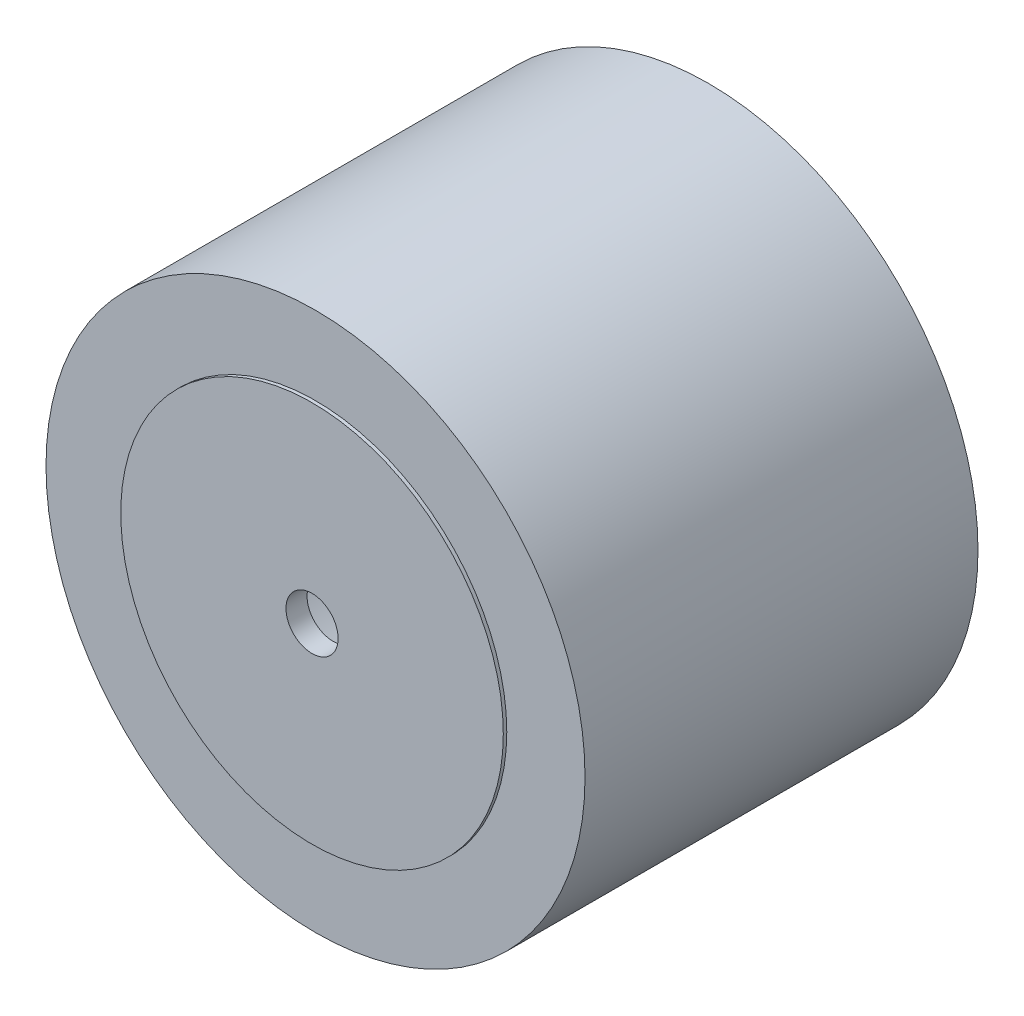
ISO-10303-21;
HEADER;
FILE_DESCRIPTION(('STEP AP214'),'2;1');
FILE_NAME('part.step','',(''),(''),'','','');
FILE_SCHEMA(('AUTOMOTIVE_DESIGN { 1 0 10303 214 1 1 1 1 }'));
ENDSEC;
DATA;
#1=APPLICATION_CONTEXT('core data for automotive mechanical design processes');
#2=APPLICATION_PROTOCOL_DEFINITION('international standard','automotive_design',2000,#1);
#3=PRODUCT_CONTEXT('',#1,'mechanical');
#4=PRODUCT('Part','Part','',(#3));
#5=PRODUCT_RELATED_PRODUCT_CATEGORY('part','',(#4));
#6=PRODUCT_DEFINITION_FORMATION('','',#4);
#7=PRODUCT_DEFINITION_CONTEXT('part definition',#1,'design');
#8=PRODUCT_DEFINITION('design','',#6,#7);
#9=PRODUCT_DEFINITION_SHAPE('','',#8);
#10=(LENGTH_UNIT() NAMED_UNIT(*) SI_UNIT(.MILLI.,.METRE.));
#11=(NAMED_UNIT(*) PLANE_ANGLE_UNIT() SI_UNIT($,.RADIAN.));
#12=(NAMED_UNIT(*) SI_UNIT($,.STERADIAN.) SOLID_ANGLE_UNIT());
#13=UNCERTAINTY_MEASURE_WITH_UNIT(LENGTH_MEASURE(1.E-05),#10,'distance_accuracy_value','');
#14=(GEOMETRIC_REPRESENTATION_CONTEXT(3) GLOBAL_UNCERTAINTY_ASSIGNED_CONTEXT((#13)) GLOBAL_UNIT_ASSIGNED_CONTEXT((#10,
#11,#12)) REPRESENTATION_CONTEXT('',''));
#15=CARTESIAN_POINT('',(0.,0.,0.));
#16=DIRECTION('',(0.,0.,1.));
#17=DIRECTION('',(1.,0.,0.));
#18=AXIS2_PLACEMENT_3D('',#15,#16,#17);
#19=CARTESIAN_POINT('',(0.,0.,0.));
#20=DIRECTION('',(0.,0.,1.));
#21=DIRECTION('',(1.,0.,0.));
#22=AXIS2_PLACEMENT_3D('',#19,#20,#21);
#23=CYLINDRICAL_SURFACE('',#22,1.5);
#24=CARTESIAN_POINT('',(0.,0.,0.200000000000002));
#25=DIRECTION('',(0.,0.,1.));
#26=DIRECTION('',(1.,0.,0.));
#27=AXIS2_PLACEMENT_3D('',#24,#25,#26);
#28=CIRCLE('',#27,1.5);
#29=CARTESIAN_POINT('',(1.5,0.,0.200000000000002));
#30=VERTEX_POINT('',#29);
#31=EDGE_CURVE('E92',#30,#30,#28,.T.);
#32=ORIENTED_EDGE('',*,*,#31,.T.);
#33=EDGE_LOOP('',(#32));
#34=FACE_BOUND('',#33,.T.);
#35=CARTESIAN_POINT('',(0.,0.,-1.01351351351352));
#36=DIRECTION('',(0.,0.,1.));
#37=DIRECTION('',(1.,0.,0.));
#38=AXIS2_PLACEMENT_3D('',#35,#36,#37);
#39=CIRCLE('',#38,1.5);
#40=CARTESIAN_POINT('',(1.5,0.,-1.01351351351352));
#41=VERTEX_POINT('',#40);
#42=EDGE_CURVE('E10',#41,#41,#39,.T.);
#43=ORIENTED_EDGE('',*,*,#42,.F.);
#44=EDGE_LOOP('',(#43));
#45=FACE_BOUND('',#44,.T.);
#46=ADVANCED_FACE('F49',(#34,#45),#23,.F.);
#47=CARTESIAN_POINT('',(1.5,0.,-1.01351351351352));
#48=DIRECTION('',(0.,0.,-1.));
#49=DIRECTION('',(-1.,0.,0.));
#50=AXIS2_PLACEMENT_3D('',#47,#48,#49);
#51=PLANE('',#50);
#52=ORIENTED_EDGE('',*,*,#42,.T.);
#53=EDGE_LOOP('',(#52));
#54=FACE_BOUND('',#53,.T.);
#55=CARTESIAN_POINT('',(0.,0.,-1.01351351351352));
#56=DIRECTION('',(0.,0.,1.));
#57=DIRECTION('',(1.,0.,0.));
#58=AXIS2_PLACEMENT_3D('',#55,#56,#57);
#59=CIRCLE('',#58,8.5);
#60=CARTESIAN_POINT('',(8.5,0.,-1.01351351351352));
#61=VERTEX_POINT('',#60);
#62=EDGE_CURVE('E56',#61,#61,#59,.T.);
#63=ORIENTED_EDGE('',*,*,#62,.F.);
#64=EDGE_LOOP('',(#63));
#65=FACE_BOUND('',#64,.T.);
#66=ADVANCED_FACE('F111',(#54,#65),#51,.T.);
#67=CARTESIAN_POINT('',(0.,0.,0.));
#68=DIRECTION('',(0.,0.,1.));
#69=DIRECTION('',(1.,0.,0.));
#70=AXIS2_PLACEMENT_3D('',#67,#68,#69);
#71=CYLINDRICAL_SURFACE('',#70,8.5);
#72=ORIENTED_EDGE('',*,*,#62,.T.);
#73=EDGE_LOOP('',(#72));
#74=FACE_BOUND('',#73,.T.);
#75=CARTESIAN_POINT('',(0.,0.,-22.8));
#76=DIRECTION('',(0.,0.,1.));
#77=DIRECTION('',(1.,0.,0.));
#78=AXIS2_PLACEMENT_3D('',#75,#76,#77);
#79=CIRCLE('',#78,8.5);
#80=CARTESIAN_POINT('',(8.5,0.,-22.8));
#81=VERTEX_POINT('',#80);
#82=EDGE_CURVE('E61',#81,#81,#79,.T.);
#83=ORIENTED_EDGE('',*,*,#82,.F.);
#84=EDGE_LOOP('',(#83));
#85=FACE_BOUND('',#84,.T.);
#86=ADVANCED_FACE('F115',(#74,#85),#71,.F.);
#87=CARTESIAN_POINT('',(8.5,0.,-22.8));
#88=DIRECTION('',(0.,0.,-1.));
#89=DIRECTION('',(-1.,0.,0.));
#90=AXIS2_PLACEMENT_3D('',#87,#88,#89);
#91=PLANE('',#90);
#92=ORIENTED_EDGE('',*,*,#82,.T.);
#93=EDGE_LOOP('',(#92));
#94=FACE_BOUND('',#93,.T.);
#95=CARTESIAN_POINT('',(0.,0.,-22.8));
#96=DIRECTION('',(0.,0.,1.));
#97=DIRECTION('',(1.,0.,0.));
#98=AXIS2_PLACEMENT_3D('',#95,#96,#97);
#99=CIRCLE('',#98,11.);
#100=CARTESIAN_POINT('',(11.,0.,-22.8));
#101=VERTEX_POINT('',#100);
#102=EDGE_CURVE('E66',#101,#101,#99,.T.);
#103=ORIENTED_EDGE('',*,*,#102,.F.);
#104=EDGE_LOOP('',(#103));
#105=FACE_BOUND('',#104,.T.);
#106=ADVANCED_FACE('F119',(#94,#105),#91,.T.);
#107=CARTESIAN_POINT('',(0.,0.,0.));
#108=DIRECTION('',(0.,0.,1.));
#109=DIRECTION('',(1.,0.,0.));
#110=AXIS2_PLACEMENT_3D('',#107,#108,#109);
#111=CYLINDRICAL_SURFACE('',#110,11.);
#112=ORIENTED_EDGE('',*,*,#102,.T.);
#113=EDGE_LOOP('',(#112));
#114=FACE_BOUND('',#113,.T.);
#115=CARTESIAN_POINT('',(0.,0.,-22.6));
#116=DIRECTION('',(0.,0.,1.));
#117=DIRECTION('',(1.,0.,0.));
#118=AXIS2_PLACEMENT_3D('',#115,#116,#117);
#119=CIRCLE('',#118,11.);
#120=CARTESIAN_POINT('',(11.,0.,-22.6));
#121=VERTEX_POINT('',#120);
#122=EDGE_CURVE('E72',#121,#121,#119,.T.);
#123=ORIENTED_EDGE('',*,*,#122,.F.);
#124=EDGE_LOOP('',(#123));
#125=FACE_BOUND('',#124,.T.);
#126=ADVANCED_FACE('F125',(#114,#125),#111,.T.);
#127=CARTESIAN_POINT('',(11.,0.,-22.6));
#128=DIRECTION('',(0.,0.,-1.));
#129=DIRECTION('',(-1.,0.,0.));
#130=AXIS2_PLACEMENT_3D('',#127,#128,#129);
#131=PLANE('',#130);
#132=ORIENTED_EDGE('',*,*,#122,.T.);
#133=EDGE_LOOP('',(#132));
#134=FACE_BOUND('',#133,.T.);
#135=CARTESIAN_POINT('',(0.,0.,-22.6));
#136=DIRECTION('',(0.,0.,1.));
#137=DIRECTION('',(1.,0.,0.));
#138=AXIS2_PLACEMENT_3D('',#135,#136,#137);
#139=CIRCLE('',#138,15.5);
#140=CARTESIAN_POINT('',(15.5,0.,-22.6));
#141=VERTEX_POINT('',#140);
#142=EDGE_CURVE('E76',#141,#141,#139,.T.);
#143=ORIENTED_EDGE('',*,*,#142,.F.);
#144=EDGE_LOOP('',(#143));
#145=FACE_BOUND('',#144,.T.);
#146=ADVANCED_FACE('F129',(#134,#145),#131,.T.);
#147=CARTESIAN_POINT('',(0.,0.,0.));
#148=DIRECTION('',(0.,0.,1.));
#149=DIRECTION('',(1.,0.,0.));
#150=AXIS2_PLACEMENT_3D('',#147,#148,#149);
#151=CYLINDRICAL_SURFACE('',#150,15.5);
#152=ORIENTED_EDGE('',*,*,#142,.T.);
#153=EDGE_LOOP('',(#152));
#154=FACE_BOUND('',#153,.T.);
#155=CARTESIAN_POINT('',(0.,0.,0.));
#156=DIRECTION('',(0.,0.,1.));
#157=DIRECTION('',(1.,0.,0.));
#158=AXIS2_PLACEMENT_3D('',#155,#156,#157);
#159=CIRCLE('',#158,15.5);
#160=CARTESIAN_POINT('',(15.5,0.,0.));
#161=VERTEX_POINT('',#160);
#162=EDGE_CURVE('E80',#161,#161,#159,.T.);
#163=ORIENTED_EDGE('',*,*,#162,.F.);
#164=EDGE_LOOP('',(#163));
#165=FACE_BOUND('',#164,.T.);
#166=ADVANCED_FACE('F133',(#154,#165),#151,.T.);
#167=CARTESIAN_POINT('',(15.5,0.,0.));
#168=DIRECTION('',(0.,0.,1.));
#169=DIRECTION('',(1.,0.,0.));
#170=AXIS2_PLACEMENT_3D('',#167,#168,#169);
#171=PLANE('',#170);
#172=ORIENTED_EDGE('',*,*,#162,.T.);
#173=EDGE_LOOP('',(#172));
#174=FACE_BOUND('',#173,.T.);
#175=CARTESIAN_POINT('',(0.,0.,0.));
#176=DIRECTION('',(0.,0.,1.));
#177=DIRECTION('',(1.,0.,0.));
#178=AXIS2_PLACEMENT_3D('',#175,#176,#177);
#179=CIRCLE('',#178,11.);
#180=CARTESIAN_POINT('',(11.,0.,0.));
#181=VERTEX_POINT('',#180);
#182=EDGE_CURVE('E84',#181,#181,#179,.T.);
#183=ORIENTED_EDGE('',*,*,#182,.F.);
#184=EDGE_LOOP('',(#183));
#185=FACE_BOUND('',#184,.T.);
#186=ADVANCED_FACE('F107',(#174,#185),#171,.T.);
#187=CARTESIAN_POINT('',(0.,0.,0.));
#188=DIRECTION('',(0.,0.,1.));
#189=DIRECTION('',(1.,0.,0.));
#190=AXIS2_PLACEMENT_3D('',#187,#188,#189);
#191=CYLINDRICAL_SURFACE('',#190,11.);
#192=ORIENTED_EDGE('',*,*,#182,.T.);
#193=EDGE_LOOP('',(#192));
#194=FACE_BOUND('',#193,.T.);
#195=CARTESIAN_POINT('',(0.,0.,0.200000000000001));
#196=DIRECTION('',(0.,0.,1.));
#197=DIRECTION('',(1.,0.,0.));
#198=AXIS2_PLACEMENT_3D('',#195,#196,#197);
#199=CIRCLE('',#198,11.);
#200=CARTESIAN_POINT('',(11.,0.,0.200000000000001));
#201=VERTEX_POINT('',#200);
#202=EDGE_CURVE('E88',#201,#201,#199,.T.);
#203=ORIENTED_EDGE('',*,*,#202,.F.);
#204=EDGE_LOOP('',(#203));
#205=FACE_BOUND('',#204,.T.);
#206=ADVANCED_FACE('F101',(#194,#205),#191,.T.);
#207=CARTESIAN_POINT('',(11.,0.,0.200000000000001));
#208=DIRECTION('',(0.,0.,1.));
#209=DIRECTION('',(1.,0.,0.));
#210=AXIS2_PLACEMENT_3D('',#207,#208,#209);
#211=PLANE('',#210);
#212=ORIENTED_EDGE('',*,*,#202,.T.);
#213=EDGE_LOOP('',(#212));
#214=FACE_BOUND('',#213,.T.);
#215=ORIENTED_EDGE('',*,*,#31,.F.);
#216=EDGE_LOOP('',(#215));
#217=FACE_BOUND('',#216,.T.);
#218=ADVANCED_FACE('F99',(#214,#217),#211,.T.);
#219=CLOSED_SHELL('',(#46,#66,#86,#106,#126,#146,#166,#186,#206,#218));
#220=MANIFOLD_SOLID_BREP('B2',#219);
#221=ADVANCED_BREP_SHAPE_REPRESENTATION('',(#18,#220),#14);
#222=SHAPE_DEFINITION_REPRESENTATION(#9,#221);
ENDSEC;
END-ISO-10303-21;
